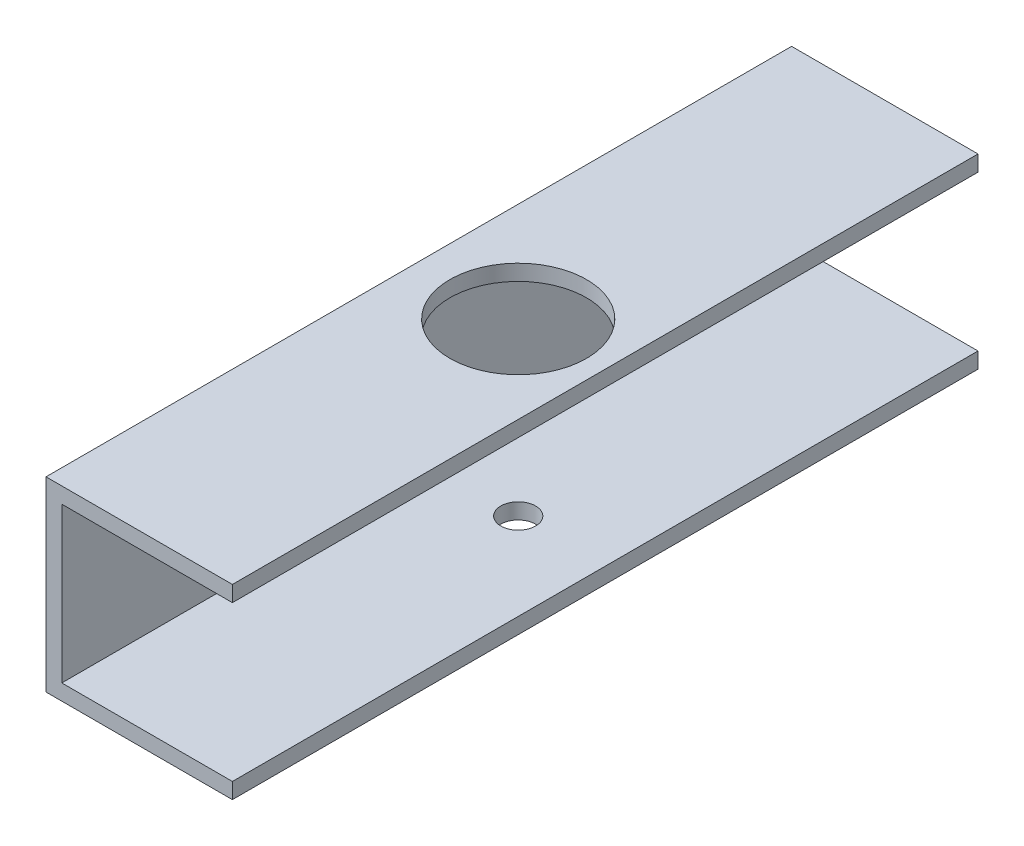
ISO-10303-21;
HEADER;
FILE_DESCRIPTION(('STEP AP214'),'2;1');
FILE_NAME('part.step','',(''),(''),'','','');
FILE_SCHEMA(('AUTOMOTIVE_DESIGN { 1 0 10303 214 1 1 1 1 }'));
ENDSEC;
DATA;
#1=APPLICATION_CONTEXT('core data for automotive mechanical design processes');
#2=APPLICATION_PROTOCOL_DEFINITION('international standard','automotive_design',2000,#1);
#3=PRODUCT_CONTEXT('',#1,'mechanical');
#4=PRODUCT('Part','Part','',(#3));
#5=PRODUCT_RELATED_PRODUCT_CATEGORY('part','',(#4));
#6=PRODUCT_DEFINITION_FORMATION('','',#4);
#7=PRODUCT_DEFINITION_CONTEXT('part definition',#1,'design');
#8=PRODUCT_DEFINITION('design','',#6,#7);
#9=PRODUCT_DEFINITION_SHAPE('','',#8);
#10=(LENGTH_UNIT() NAMED_UNIT(*) SI_UNIT(.MILLI.,.METRE.));
#11=(NAMED_UNIT(*) PLANE_ANGLE_UNIT() SI_UNIT($,.RADIAN.));
#12=(NAMED_UNIT(*) SI_UNIT($,.STERADIAN.) SOLID_ANGLE_UNIT());
#13=UNCERTAINTY_MEASURE_WITH_UNIT(LENGTH_MEASURE(1.E-05),#10,'distance_accuracy_value','');
#14=(GEOMETRIC_REPRESENTATION_CONTEXT(3) GLOBAL_UNCERTAINTY_ASSIGNED_CONTEXT((#13)) GLOBAL_UNIT_ASSIGNED_CONTEXT((#10,
#11,#12)) REPRESENTATION_CONTEXT('',''));
#15=CARTESIAN_POINT('',(0.,0.,0.));
#16=DIRECTION('',(0.,0.,1.));
#17=DIRECTION('',(1.,0.,0.));
#18=AXIS2_PLACEMENT_3D('',#15,#16,#17);
#19=CARTESIAN_POINT('',(75.,-37.5,300.));
#20=DIRECTION('',(0.,1.,0.));
#21=DIRECTION('',(0.,0.,1.));
#22=AXIS2_PLACEMENT_3D('',#19,#20,#21);
#23=PLANE('',#22);
#24=CARTESIAN_POINT('',(40.,-37.5,150.));
#25=DIRECTION('',(0.,-1.,0.));
#26=DIRECTION('',(0.,0.,-1.));
#27=AXIS2_PLACEMENT_3D('',#24,#25,#26);
#28=CIRCLE('',#27,7.);
#29=CARTESIAN_POINT('',(40.,-37.5,143.));
#30=VERTEX_POINT('',#29);
#31=EDGE_CURVE('E185',#30,#30,#28,.T.);
#32=ORIENTED_EDGE('',*,*,#31,.F.);
#33=EDGE_LOOP('',(#32));
#34=FACE_BOUND('',#33,.T.);
#35=DIRECTION('',(1.,0.,0.));
#36=VECTOR('',#35,1.);
#37=CARTESIAN_POINT('',(75.,-37.5,0.));
#38=LINE('',#37,#36);
#39=CARTESIAN_POINT('',(0.,-37.5,0.));
#40=VERTEX_POINT('',#39);
#41=CARTESIAN_POINT('',(75.,-37.5,0.));
#42=VERTEX_POINT('',#41);
#43=EDGE_CURVE('E131',#40,#42,#38,.T.);
#44=ORIENTED_EDGE('',*,*,#43,.T.);
#45=DIRECTION('',(0.,0.,-1.));
#46=VECTOR('',#45,1.);
#47=CARTESIAN_POINT('',(75.,-37.5,300.));
#48=LINE('',#47,#46);
#49=CARTESIAN_POINT('',(75.,-37.5,300.));
#50=VERTEX_POINT('',#49);
#51=EDGE_CURVE('E11',#50,#42,#48,.T.);
#52=ORIENTED_EDGE('',*,*,#51,.F.);
#53=DIRECTION('',(1.,0.,0.));
#54=VECTOR('',#53,1.);
#55=CARTESIAN_POINT('',(75.,-37.5,300.));
#56=LINE('',#55,#54);
#57=CARTESIAN_POINT('',(0.,-37.5,300.));
#58=VERTEX_POINT('',#57);
#59=EDGE_CURVE('E146',#58,#50,#56,.T.);
#60=ORIENTED_EDGE('',*,*,#59,.F.);
#61=DIRECTION('',(0.,0.,-1.));
#62=VECTOR('',#61,1.);
#63=CARTESIAN_POINT('',(0.,-37.5,300.));
#64=LINE('',#63,#62);
#65=EDGE_CURVE('E127',#58,#40,#64,.T.);
#66=ORIENTED_EDGE('',*,*,#65,.T.);
#67=EDGE_LOOP('',(#44,#52,#60,#66));
#68=FACE_BOUND('',#67,.T.);
#69=ADVANCED_FACE('F34',(#34,#68),#23,.F.);
#70=CARTESIAN_POINT('',(75.,-31.15,300.));
#71=DIRECTION('',(-1.,0.,0.));
#72=DIRECTION('',(0.,-1.,0.));
#73=AXIS2_PLACEMENT_3D('',#70,#71,#72);
#74=PLANE('',#73);
#75=DIRECTION('',(0.,1.,0.));
#76=VECTOR('',#75,1.);
#77=CARTESIAN_POINT('',(75.,-31.15,0.));
#78=LINE('',#77,#76);
#79=CARTESIAN_POINT('',(75.,-31.15,0.));
#80=VERTEX_POINT('',#79);
#81=EDGE_CURVE('E134',#42,#80,#78,.T.);
#82=ORIENTED_EDGE('',*,*,#81,.T.);
#83=DIRECTION('',(0.,0.,-1.));
#84=VECTOR('',#83,1.);
#85=CARTESIAN_POINT('',(75.,-31.15,300.));
#86=LINE('',#85,#84);
#87=CARTESIAN_POINT('',(75.,-31.15,300.));
#88=VERTEX_POINT('',#87);
#89=EDGE_CURVE('E43',#88,#80,#86,.T.);
#90=ORIENTED_EDGE('',*,*,#89,.F.);
#91=DIRECTION('',(0.,1.,0.));
#92=VECTOR('',#91,1.);
#93=CARTESIAN_POINT('',(75.,-31.15,300.));
#94=LINE('',#93,#92);
#95=EDGE_CURVE('E94',#50,#88,#94,.T.);
#96=ORIENTED_EDGE('',*,*,#95,.F.);
#97=ORIENTED_EDGE('',*,*,#51,.T.);
#98=EDGE_LOOP('',(#82,#90,#96,#97));
#99=FACE_BOUND('',#98,.T.);
#100=ADVANCED_FACE('F203',(#99),#74,.F.);
#101=CARTESIAN_POINT('',(6.35000000000001,-31.15,300.));
#102=DIRECTION('',(0.,-1.,0.));
#103=DIRECTION('',(0.,0.,-1.));
#104=AXIS2_PLACEMENT_3D('',#101,#102,#103);
#105=PLANE('',#104);
#106=CARTESIAN_POINT('',(40.,-31.15,150.));
#107=DIRECTION('',(0.,-1.,0.));
#108=DIRECTION('',(0.,0.,-1.));
#109=AXIS2_PLACEMENT_3D('',#106,#107,#108);
#110=CIRCLE('',#109,7.);
#111=CARTESIAN_POINT('',(40.,-31.15,143.));
#112=VERTEX_POINT('',#111);
#113=EDGE_CURVE('E37',#112,#112,#110,.T.);
#114=ORIENTED_EDGE('',*,*,#113,.T.);
#115=EDGE_LOOP('',(#114));
#116=FACE_BOUND('',#115,.T.);
#117=DIRECTION('',(-1.,0.,0.));
#118=VECTOR('',#117,1.);
#119=CARTESIAN_POINT('',(6.35000000000001,-31.15,0.));
#120=LINE('',#119,#118);
#121=CARTESIAN_POINT('',(6.35000000000001,-31.15,0.));
#122=VERTEX_POINT('',#121);
#123=EDGE_CURVE('E137',#80,#122,#120,.T.);
#124=ORIENTED_EDGE('',*,*,#123,.T.);
#125=DIRECTION('',(0.,0.,-1.));
#126=VECTOR('',#125,1.);
#127=CARTESIAN_POINT('',(6.35000000000001,-31.15,300.));
#128=LINE('',#127,#126);
#129=CARTESIAN_POINT('',(6.35000000000001,-31.15,300.));
#130=VERTEX_POINT('',#129);
#131=EDGE_CURVE('E153',#130,#122,#128,.T.);
#132=ORIENTED_EDGE('',*,*,#131,.F.);
#133=DIRECTION('',(-1.,0.,0.));
#134=VECTOR('',#133,1.);
#135=CARTESIAN_POINT('',(6.35000000000001,-31.15,300.));
#136=LINE('',#135,#134);
#137=EDGE_CURVE('E162',#88,#130,#136,.T.);
#138=ORIENTED_EDGE('',*,*,#137,.F.);
#139=ORIENTED_EDGE('',*,*,#89,.T.);
#140=EDGE_LOOP('',(#124,#132,#138,#139));
#141=FACE_BOUND('',#140,.T.);
#142=ADVANCED_FACE('F160',(#116,#141),#105,.F.);
#143=CARTESIAN_POINT('',(6.35000000000001,31.15,300.));
#144=DIRECTION('',(-1.,0.,0.));
#145=DIRECTION('',(0.,0.,1.));
#146=AXIS2_PLACEMENT_3D('',#143,#144,#145);
#147=PLANE('',#146);
#148=DIRECTION('',(0.,1.,0.));
#149=VECTOR('',#148,1.);
#150=CARTESIAN_POINT('',(6.35000000000001,31.15,0.));
#151=LINE('',#150,#149);
#152=CARTESIAN_POINT('',(6.35000000000001,31.15,0.));
#153=VERTEX_POINT('',#152);
#154=EDGE_CURVE('E139',#122,#153,#151,.T.);
#155=ORIENTED_EDGE('',*,*,#154,.T.);
#156=DIRECTION('',(0.,0.,-1.));
#157=VECTOR('',#156,1.);
#158=CARTESIAN_POINT('',(6.35000000000001,31.15,300.));
#159=LINE('',#158,#157);
#160=CARTESIAN_POINT('',(6.35000000000001,31.15,300.));
#161=VERTEX_POINT('',#160);
#162=EDGE_CURVE('E150',#161,#153,#159,.T.);
#163=ORIENTED_EDGE('',*,*,#162,.F.);
#164=DIRECTION('',(0.,1.,0.));
#165=VECTOR('',#164,1.);
#166=CARTESIAN_POINT('',(6.35000000000001,31.15,300.));
#167=LINE('',#166,#165);
#168=EDGE_CURVE('E174',#130,#161,#167,.T.);
#169=ORIENTED_EDGE('',*,*,#168,.F.);
#170=ORIENTED_EDGE('',*,*,#131,.T.);
#171=EDGE_LOOP('',(#155,#163,#169,#170));
#172=FACE_BOUND('',#171,.T.);
#173=ADVANCED_FACE('F170',(#172),#147,.F.);
#174=CARTESIAN_POINT('',(75.,31.15,300.));
#175=DIRECTION('',(0.,1.,0.));
#176=DIRECTION('',(0.,0.,1.));
#177=AXIS2_PLACEMENT_3D('',#174,#175,#176);
#178=PLANE('',#177);
#179=CARTESIAN_POINT('',(40.,31.15,150.));
#180=DIRECTION('',(0.,1.,0.));
#181=DIRECTION('',(0.,0.,1.));
#182=AXIS2_PLACEMENT_3D('',#179,#180,#181);
#183=CIRCLE('',#182,27.5);
#184=CARTESIAN_POINT('',(40.,31.15,177.5));
#185=VERTEX_POINT('',#184);
#186=EDGE_CURVE('E135',#185,#185,#183,.T.);
#187=ORIENTED_EDGE('',*,*,#186,.T.);
#188=EDGE_LOOP('',(#187));
#189=FACE_BOUND('',#188,.T.);
#190=DIRECTION('',(1.,0.,0.));
#191=VECTOR('',#190,1.);
#192=CARTESIAN_POINT('',(75.,31.15,0.));
#193=LINE('',#192,#191);
#194=CARTESIAN_POINT('',(75.,31.15,0.));
#195=VERTEX_POINT('',#194);
#196=EDGE_CURVE('E141',#153,#195,#193,.T.);
#197=ORIENTED_EDGE('',*,*,#196,.T.);
#198=DIRECTION('',(0.,0.,-1.));
#199=VECTOR('',#198,1.);
#200=CARTESIAN_POINT('',(75.,31.15,300.));
#201=LINE('',#200,#199);
#202=CARTESIAN_POINT('',(75.,31.15,300.));
#203=VERTEX_POINT('',#202);
#204=EDGE_CURVE('E122',#203,#195,#201,.T.);
#205=ORIENTED_EDGE('',*,*,#204,.F.);
#206=DIRECTION('',(1.,0.,0.));
#207=VECTOR('',#206,1.);
#208=CARTESIAN_POINT('',(75.,31.15,300.));
#209=LINE('',#208,#207);
#210=EDGE_CURVE('E113',#161,#203,#209,.T.);
#211=ORIENTED_EDGE('',*,*,#210,.F.);
#212=ORIENTED_EDGE('',*,*,#162,.T.);
#213=EDGE_LOOP('',(#197,#205,#211,#212));
#214=FACE_BOUND('',#213,.T.);
#215=ADVANCED_FACE('F173',(#189,#214),#178,.F.);
#216=CARTESIAN_POINT('',(75.,37.5,300.));
#217=DIRECTION('',(-1.,0.,0.));
#218=DIRECTION('',(0.,-1.,0.));
#219=AXIS2_PLACEMENT_3D('',#216,#217,#218);
#220=PLANE('',#219);
#221=DIRECTION('',(0.,1.,0.));
#222=VECTOR('',#221,1.);
#223=CARTESIAN_POINT('',(75.,37.5,0.));
#224=LINE('',#223,#222);
#225=CARTESIAN_POINT('',(75.,37.5,0.));
#226=VERTEX_POINT('',#225);
#227=EDGE_CURVE('E121',#195,#226,#224,.T.);
#228=ORIENTED_EDGE('',*,*,#227,.T.);
#229=DIRECTION('',(0.,0.,-1.));
#230=VECTOR('',#229,1.);
#231=CARTESIAN_POINT('',(75.,37.5,300.));
#232=LINE('',#231,#230);
#233=CARTESIAN_POINT('',(75.,37.5,300.));
#234=VERTEX_POINT('',#233);
#235=EDGE_CURVE('E118',#234,#226,#232,.T.);
#236=ORIENTED_EDGE('',*,*,#235,.F.);
#237=DIRECTION('',(0.,1.,0.));
#238=VECTOR('',#237,1.);
#239=CARTESIAN_POINT('',(75.,37.5,300.));
#240=LINE('',#239,#238);
#241=EDGE_CURVE('E107',#203,#234,#240,.T.);
#242=ORIENTED_EDGE('',*,*,#241,.F.);
#243=ORIENTED_EDGE('',*,*,#204,.T.);
#244=EDGE_LOOP('',(#228,#236,#242,#243));
#245=FACE_BOUND('',#244,.T.);
#246=ADVANCED_FACE('F119',(#245),#220,.F.);
#247=CARTESIAN_POINT('',(0.,37.5,300.));
#248=DIRECTION('',(0.,-1.,0.));
#249=DIRECTION('',(0.,0.,-1.));
#250=AXIS2_PLACEMENT_3D('',#247,#248,#249);
#251=PLANE('',#250);
#252=CARTESIAN_POINT('',(40.,37.5,150.));
#253=DIRECTION('',(0.,1.,0.));
#254=DIRECTION('',(0.,0.,1.));
#255=AXIS2_PLACEMENT_3D('',#252,#253,#254);
#256=CIRCLE('',#255,27.5);
#257=CARTESIAN_POINT('',(40.,37.5,177.5));
#258=VERTEX_POINT('',#257);
#259=EDGE_CURVE('E182',#258,#258,#256,.T.);
#260=ORIENTED_EDGE('',*,*,#259,.F.);
#261=EDGE_LOOP('',(#260));
#262=FACE_BOUND('',#261,.T.);
#263=DIRECTION('',(-1.,0.,0.));
#264=VECTOR('',#263,1.);
#265=CARTESIAN_POINT('',(0.,37.5,0.));
#266=LINE('',#265,#264);
#267=CARTESIAN_POINT('',(0.,37.5,0.));
#268=VERTEX_POINT('',#267);
#269=EDGE_CURVE('E80',#226,#268,#266,.T.);
#270=ORIENTED_EDGE('',*,*,#269,.T.);
#271=DIRECTION('',(0.,0.,-1.));
#272=VECTOR('',#271,1.);
#273=CARTESIAN_POINT('',(0.,37.5,300.));
#274=LINE('',#273,#272);
#275=CARTESIAN_POINT('',(0.,37.5,300.));
#276=VERTEX_POINT('',#275);
#277=EDGE_CURVE('E123',#276,#268,#274,.T.);
#278=ORIENTED_EDGE('',*,*,#277,.F.);
#279=DIRECTION('',(-1.,0.,0.));
#280=VECTOR('',#279,1.);
#281=CARTESIAN_POINT('',(0.,37.5,300.));
#282=LINE('',#281,#280);
#283=EDGE_CURVE('E111',#234,#276,#282,.T.);
#284=ORIENTED_EDGE('',*,*,#283,.F.);
#285=ORIENTED_EDGE('',*,*,#235,.T.);
#286=EDGE_LOOP('',(#270,#278,#284,#285));
#287=FACE_BOUND('',#286,.T.);
#288=ADVANCED_FACE('F125',(#262,#287),#251,.F.);
#289=CARTESIAN_POINT('',(0.,-37.5,300.));
#290=DIRECTION('',(1.,0.,0.));
#291=DIRECTION('',(0.,0.,-1.));
#292=AXIS2_PLACEMENT_3D('',#289,#290,#291);
#293=PLANE('',#292);
#294=DIRECTION('',(0.,-1.,0.));
#295=VECTOR('',#294,1.);
#296=CARTESIAN_POINT('',(0.,-37.5,0.));
#297=LINE('',#296,#295);
#298=EDGE_CURVE('E86',#268,#40,#297,.T.);
#299=ORIENTED_EDGE('',*,*,#298,.T.);
#300=ORIENTED_EDGE('',*,*,#65,.F.);
#301=DIRECTION('',(0.,-1.,0.));
#302=VECTOR('',#301,1.);
#303=CARTESIAN_POINT('',(0.,-37.5,300.));
#304=LINE('',#303,#302);
#305=EDGE_CURVE('E51',#276,#58,#304,.T.);
#306=ORIENTED_EDGE('',*,*,#305,.F.);
#307=ORIENTED_EDGE('',*,*,#277,.T.);
#308=EDGE_LOOP('',(#299,#300,#306,#307));
#309=FACE_BOUND('',#308,.T.);
#310=ADVANCED_FACE('F213',(#309),#293,.F.);
#311=CARTESIAN_POINT('',(0.,0.,300.));
#312=DIRECTION('',(0.,0.,-1.));
#313=DIRECTION('',(-1.,0.,0.));
#314=AXIS2_PLACEMENT_3D('',#311,#312,#313);
#315=PLANE('',#314);
#316=ORIENTED_EDGE('',*,*,#59,.T.);
#317=ORIENTED_EDGE('',*,*,#95,.T.);
#318=ORIENTED_EDGE('',*,*,#137,.T.);
#319=ORIENTED_EDGE('',*,*,#168,.T.);
#320=ORIENTED_EDGE('',*,*,#210,.T.);
#321=ORIENTED_EDGE('',*,*,#241,.T.);
#322=ORIENTED_EDGE('',*,*,#283,.T.);
#323=ORIENTED_EDGE('',*,*,#305,.T.);
#324=EDGE_LOOP('',(#316,#317,#318,#319,#320,#321,#322,#323));
#325=FACE_BOUND('',#324,.T.);
#326=ADVANCED_FACE('F109',(#325),#315,.F.);
#327=CARTESIAN_POINT('',(0.,0.,0.));
#328=DIRECTION('',(0.,0.,-1.));
#329=DIRECTION('',(-1.,0.,0.));
#330=AXIS2_PLACEMENT_3D('',#327,#328,#329);
#331=PLANE('',#330);
#332=ORIENTED_EDGE('',*,*,#43,.F.);
#333=ORIENTED_EDGE('',*,*,#298,.F.);
#334=ORIENTED_EDGE('',*,*,#269,.F.);
#335=ORIENTED_EDGE('',*,*,#227,.F.);
#336=ORIENTED_EDGE('',*,*,#196,.F.);
#337=ORIENTED_EDGE('',*,*,#154,.F.);
#338=ORIENTED_EDGE('',*,*,#123,.F.);
#339=ORIENTED_EDGE('',*,*,#81,.F.);
#340=EDGE_LOOP('',(#332,#333,#334,#335,#336,#337,#338,#339));
#341=FACE_BOUND('',#340,.T.);
#342=ADVANCED_FACE('F166',(#341),#331,.T.);
#343=CARTESIAN_POINT('',(40.,27.5,150.));
#344=DIRECTION('',(0.,1.,0.));
#345=DIRECTION('',(0.,0.,1.));
#346=AXIS2_PLACEMENT_3D('',#343,#344,#345);
#347=CYLINDRICAL_SURFACE('',#346,27.5);
#348=ORIENTED_EDGE('',*,*,#259,.T.);
#349=EDGE_LOOP('',(#348));
#350=FACE_BOUND('',#349,.T.);
#351=ORIENTED_EDGE('',*,*,#186,.F.);
#352=EDGE_LOOP('',(#351));
#353=FACE_BOUND('',#352,.T.);
#354=ADVANCED_FACE('F195',(#350,#353),#347,.F.);
#355=CARTESIAN_POINT('',(40.,-27.5,150.));
#356=DIRECTION('',(0.,-1.,0.));
#357=DIRECTION('',(0.,0.,-1.));
#358=AXIS2_PLACEMENT_3D('',#355,#356,#357);
#359=CYLINDRICAL_SURFACE('',#358,7.);
#360=ORIENTED_EDGE('',*,*,#31,.T.);
#361=EDGE_LOOP('',(#360));
#362=FACE_BOUND('',#361,.T.);
#363=ORIENTED_EDGE('',*,*,#113,.F.);
#364=EDGE_LOOP('',(#363));
#365=FACE_BOUND('',#364,.T.);
#366=ADVANCED_FACE('F193',(#362,#365),#359,.F.);
#367=CLOSED_SHELL('',(#69,#100,#142,#173,#215,#246,#288,#310,#326,#342,#354,#366));
#368=MANIFOLD_SOLID_BREP('B2',#367);
#369=ADVANCED_BREP_SHAPE_REPRESENTATION('',(#18,#368),#14);
#370=SHAPE_DEFINITION_REPRESENTATION(#9,#369);
ENDSEC;
END-ISO-10303-21;
